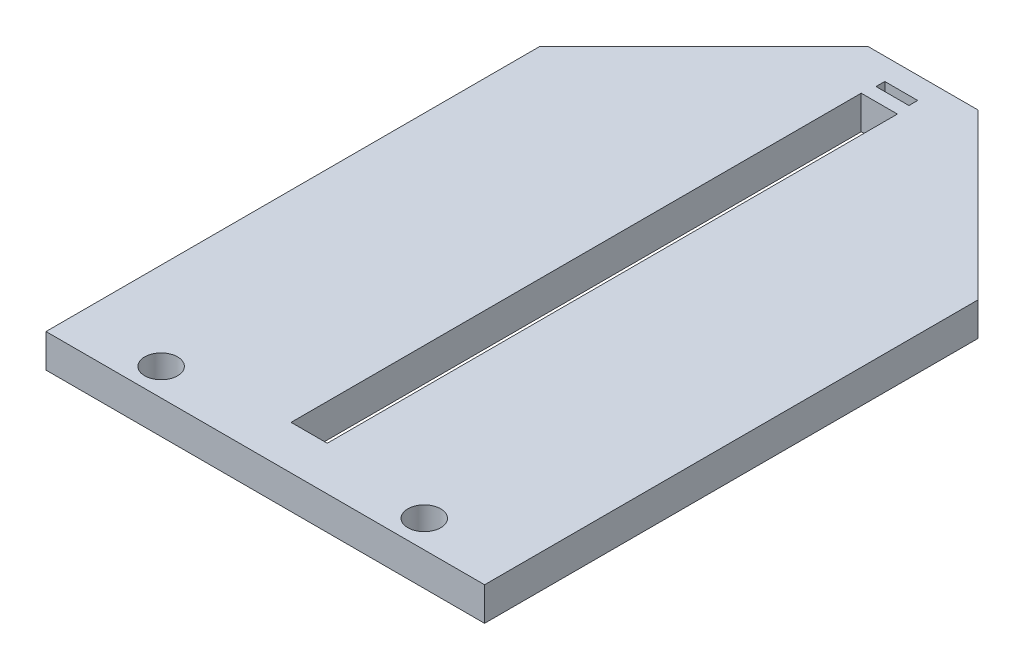
ISO-10303-21;
HEADER;
FILE_DESCRIPTION(('STEP AP214'),'2;1');
FILE_NAME('part.step','',(''),(''),'','','');
FILE_SCHEMA(('AUTOMOTIVE_DESIGN { 1 0 10303 214 1 1 1 1 }'));
ENDSEC;
DATA;
#1=APPLICATION_CONTEXT('core data for automotive mechanical design processes');
#2=APPLICATION_PROTOCOL_DEFINITION('international standard','automotive_design',2000,#1);
#3=PRODUCT_CONTEXT('',#1,'mechanical');
#4=PRODUCT('Part','Part','',(#3));
#5=PRODUCT_RELATED_PRODUCT_CATEGORY('part','',(#4));
#6=PRODUCT_DEFINITION_FORMATION('','',#4);
#7=PRODUCT_DEFINITION_CONTEXT('part definition',#1,'design');
#8=PRODUCT_DEFINITION('design','',#6,#7);
#9=PRODUCT_DEFINITION_SHAPE('','',#8);
#10=(LENGTH_UNIT() NAMED_UNIT(*) SI_UNIT(.MILLI.,.METRE.));
#11=(NAMED_UNIT(*) PLANE_ANGLE_UNIT() SI_UNIT($,.RADIAN.));
#12=(NAMED_UNIT(*) SI_UNIT($,.STERADIAN.) SOLID_ANGLE_UNIT());
#13=UNCERTAINTY_MEASURE_WITH_UNIT(LENGTH_MEASURE(1.E-05),#10,'distance_accuracy_value','');
#14=(GEOMETRIC_REPRESENTATION_CONTEXT(3) GLOBAL_UNCERTAINTY_ASSIGNED_CONTEXT((#13)) GLOBAL_UNIT_ASSIGNED_CONTEXT((#10,
#11,#12)) REPRESENTATION_CONTEXT('',''));
#15=CARTESIAN_POINT('',(0.,0.,0.));
#16=DIRECTION('',(0.,0.,1.));
#17=DIRECTION('',(1.,0.,0.));
#18=AXIS2_PLACEMENT_3D('',#15,#16,#17);
#19=CARTESIAN_POINT('',(0.,3.05,0.));
#20=DIRECTION('',(0.,0.,-1.));
#21=DIRECTION('',(-1.,0.,0.));
#22=AXIS2_PLACEMENT_3D('',#19,#20,#21);
#23=PLANE('',#22);
#24=DIRECTION('',(1.,0.,0.));
#25=VECTOR('',#24,1.);
#26=CARTESIAN_POINT('',(0.,0.,0.));
#27=LINE('',#26,#25);
#28=CARTESIAN_POINT('',(0.,0.,0.));
#29=VERTEX_POINT('',#28);
#30=CARTESIAN_POINT('',(40.,0.,0.));
#31=VERTEX_POINT('',#30);
#32=EDGE_CURVE('E174',#29,#31,#27,.T.);
#33=ORIENTED_EDGE('',*,*,#32,.T.);
#34=DIRECTION('',(0.,-1.,0.));
#35=VECTOR('',#34,1.);
#36=CARTESIAN_POINT('',(40.,3.05,0.));
#37=LINE('',#36,#35);
#38=CARTESIAN_POINT('',(40.,3.05,0.));
#39=VERTEX_POINT('',#38);
#40=EDGE_CURVE('E168',#39,#31,#37,.T.);
#41=ORIENTED_EDGE('',*,*,#40,.F.);
#42=DIRECTION('',(1.,0.,0.));
#43=VECTOR('',#42,1.);
#44=CARTESIAN_POINT('',(0.,3.05,0.));
#45=LINE('',#44,#43);
#46=CARTESIAN_POINT('',(0.,3.05,0.));
#47=VERTEX_POINT('',#46);
#48=EDGE_CURVE('E185',#47,#39,#45,.T.);
#49=ORIENTED_EDGE('',*,*,#48,.F.);
#50=DIRECTION('',(0.,-1.,0.));
#51=VECTOR('',#50,1.);
#52=CARTESIAN_POINT('',(0.,3.05,0.));
#53=LINE('',#52,#51);
#54=EDGE_CURVE('E165',#47,#29,#53,.T.);
#55=ORIENTED_EDGE('',*,*,#54,.T.);
#56=EDGE_LOOP('',(#33,#41,#49,#55));
#57=FACE_BOUND('',#56,.T.);
#58=ADVANCED_FACE('F44',(#57),#23,.F.);
#59=CARTESIAN_POINT('',(40.,3.05,0.));
#60=DIRECTION('',(-1.,0.,0.));
#61=DIRECTION('',(0.,0.,1.));
#62=AXIS2_PLACEMENT_3D('',#59,#60,#61);
#63=PLANE('',#62);
#64=DIRECTION('',(0.,0.,-1.));
#65=VECTOR('',#64,1.);
#66=CARTESIAN_POINT('',(40.,0.,0.));
#67=LINE('',#66,#65);
#68=CARTESIAN_POINT('',(40.,0.,-45.));
#69=VERTEX_POINT('',#68);
#70=EDGE_CURVE('E177',#31,#69,#67,.T.);
#71=ORIENTED_EDGE('',*,*,#70,.T.);
#72=DIRECTION('',(0.,1.,0.));
#73=VECTOR('',#72,1.);
#74=CARTESIAN_POINT('',(40.,-6.95,-45.));
#75=LINE('',#74,#73);
#76=CARTESIAN_POINT('',(40.,3.05,-45.));
#77=VERTEX_POINT('',#76);
#78=EDGE_CURVE('E60',#69,#77,#75,.T.);
#79=ORIENTED_EDGE('',*,*,#78,.T.);
#80=DIRECTION('',(0.,0.,-1.));
#81=VECTOR('',#80,1.);
#82=CARTESIAN_POINT('',(40.,3.05,0.));
#83=LINE('',#82,#81);
#84=EDGE_CURVE('E170',#39,#77,#83,.T.);
#85=ORIENTED_EDGE('',*,*,#84,.F.);
#86=ORIENTED_EDGE('',*,*,#40,.T.);
#87=EDGE_LOOP('',(#71,#79,#85,#86));
#88=FACE_BOUND('',#87,.T.);
#89=ADVANCED_FACE('F274',(#88),#63,.F.);
#90=CARTESIAN_POINT('',(0.,3.05,-60.));
#91=DIRECTION('',(0.,0.,-1.));
#92=DIRECTION('',(-1.,0.,0.));
#93=AXIS2_PLACEMENT_3D('',#90,#91,#92);
#94=PLANE('',#93);
#95=DIRECTION('',(0.,1.,0.));
#96=VECTOR('',#95,1.);
#97=CARTESIAN_POINT('',(15.,-6.95,-60.));
#98=LINE('',#97,#96);
#99=CARTESIAN_POINT('',(15.,0.,-60.));
#100=VERTEX_POINT('',#99);
#101=CARTESIAN_POINT('',(15.,3.05,-60.));
#102=VERTEX_POINT('',#101);
#103=EDGE_CURVE('E68',#100,#102,#98,.T.);
#104=ORIENTED_EDGE('',*,*,#103,.T.);
#105=DIRECTION('',(1.,0.,0.));
#106=VECTOR('',#105,1.);
#107=CARTESIAN_POINT('',(0.,3.05,-60.));
#108=LINE('',#107,#106);
#109=CARTESIAN_POINT('',(25.,3.05,-60.));
#110=VERTEX_POINT('',#109);
#111=EDGE_CURVE('E161',#102,#110,#108,.T.);
#112=ORIENTED_EDGE('',*,*,#111,.T.);
#113=DIRECTION('',(0.,1.,0.));
#114=VECTOR('',#113,1.);
#115=CARTESIAN_POINT('',(25.,-6.95,-60.));
#116=LINE('',#115,#114);
#117=CARTESIAN_POINT('',(25.,0.,-60.));
#118=VERTEX_POINT('',#117);
#119=EDGE_CURVE('E229',#118,#110,#116,.T.);
#120=ORIENTED_EDGE('',*,*,#119,.F.);
#121=DIRECTION('',(1.,0.,0.));
#122=VECTOR('',#121,1.);
#123=CARTESIAN_POINT('',(0.,0.,-60.));
#124=LINE('',#123,#122);
#125=EDGE_CURVE('E181',#100,#118,#124,.T.);
#126=ORIENTED_EDGE('',*,*,#125,.F.);
#127=EDGE_LOOP('',(#104,#112,#120,#126));
#128=FACE_BOUND('',#127,.T.);
#129=ADVANCED_FACE('F282',(#128),#94,.T.);
#130=CARTESIAN_POINT('',(0.,3.05,0.));
#131=DIRECTION('',(-1.,0.,0.));
#132=DIRECTION('',(0.,0.,1.));
#133=AXIS2_PLACEMENT_3D('',#130,#131,#132);
#134=PLANE('',#133);
#135=DIRECTION('',(0.,1.,0.));
#136=VECTOR('',#135,1.);
#137=CARTESIAN_POINT('',(0.,-6.95,-45.));
#138=LINE('',#137,#136);
#139=CARTESIAN_POINT('',(0.,0.,-45.));
#140=VERTEX_POINT('',#139);
#141=CARTESIAN_POINT('',(0.,3.05,-45.));
#142=VERTEX_POINT('',#141);
#143=EDGE_CURVE('E143',#140,#142,#138,.T.);
#144=ORIENTED_EDGE('',*,*,#143,.F.);
#145=DIRECTION('',(0.,0.,-1.));
#146=VECTOR('',#145,1.);
#147=CARTESIAN_POINT('',(0.,0.,0.));
#148=LINE('',#147,#146);
#149=EDGE_CURVE('E184',#29,#140,#148,.T.);
#150=ORIENTED_EDGE('',*,*,#149,.F.);
#151=ORIENTED_EDGE('',*,*,#54,.F.);
#152=DIRECTION('',(0.,0.,-1.));
#153=VECTOR('',#152,1.);
#154=CARTESIAN_POINT('',(0.,3.05,0.));
#155=LINE('',#154,#153);
#156=EDGE_CURVE('E158',#47,#142,#155,.T.);
#157=ORIENTED_EDGE('',*,*,#156,.T.);
#158=EDGE_LOOP('',(#144,#150,#151,#157));
#159=FACE_BOUND('',#158,.T.);
#160=ADVANCED_FACE('F164',(#159),#134,.T.);
#161=CARTESIAN_POINT('',(0.,3.05,0.));
#162=DIRECTION('',(0.,1.,0.));
#163=DIRECTION('',(0.,0.,1.));
#164=AXIS2_PLACEMENT_3D('',#161,#162,#163);
#165=PLANE('',#164);
#166=CARTESIAN_POINT('',(8.,3.05,-2.5));
#167=DIRECTION('',(0.,1.,0.));
#168=DIRECTION('',(0.,0.,1.));
#169=AXIS2_PLACEMENT_3D('',#166,#167,#168);
#170=CIRCLE('',#169,1.5);
#171=CARTESIAN_POINT('',(8.,3.05,-0.999999999999999));
#172=VERTEX_POINT('',#171);
#173=EDGE_CURVE('E215',#172,#172,#170,.T.);
#174=ORIENTED_EDGE('',*,*,#173,.F.);
#175=EDGE_LOOP('',(#174));
#176=FACE_BOUND('',#175,.T.);
#177=CARTESIAN_POINT('',(32.,3.05,-2.5));
#178=DIRECTION('',(0.,1.,0.));
#179=DIRECTION('',(0.,0.,1.));
#180=AXIS2_PLACEMENT_3D('',#177,#178,#179);
#181=CIRCLE('',#180,1.50000000000003);
#182=CARTESIAN_POINT('',(32.,3.05,-0.999999999999974));
#183=VERTEX_POINT('',#182);
#184=EDGE_CURVE('E220',#183,#183,#181,.T.);
#185=ORIENTED_EDGE('',*,*,#184,.F.);
#186=EDGE_LOOP('',(#185));
#187=FACE_BOUND('',#186,.T.);
#188=DIRECTION('',(0.707106781186547,0.,-0.707106781186548));
#189=VECTOR('',#188,1.);
#190=CARTESIAN_POINT('',(15.,3.05,-60.));
#191=LINE('',#190,#189);
#192=EDGE_CURVE('E146',#142,#102,#191,.T.);
#193=ORIENTED_EDGE('',*,*,#192,.F.);
#194=ORIENTED_EDGE('',*,*,#156,.F.);
#195=ORIENTED_EDGE('',*,*,#48,.T.);
#196=ORIENTED_EDGE('',*,*,#84,.T.);
#197=DIRECTION('',(0.707106781186547,0.,0.707106781186547));
#198=VECTOR('',#197,1.);
#199=CARTESIAN_POINT('',(25.,3.05,-60.));
#200=LINE('',#199,#198);
#201=EDGE_CURVE('E162',#110,#77,#200,.T.);
#202=ORIENTED_EDGE('',*,*,#201,.F.);
#203=ORIENTED_EDGE('',*,*,#111,.F.);
#204=EDGE_LOOP('',(#193,#194,#195,#196,#202,#203));
#205=FACE_BOUND('',#204,.T.);
#206=DIRECTION('',(1.,0.,0.));
#207=VECTOR('',#206,1.);
#208=CARTESIAN_POINT('',(0.,3.05,-4.));
#209=LINE('',#208,#207);
#210=CARTESIAN_POINT('',(18.35,3.05,-4.));
#211=VERTEX_POINT('',#210);
#212=CARTESIAN_POINT('',(21.65,3.05,-4.));
#213=VERTEX_POINT('',#212);
#214=EDGE_CURVE('E233',#211,#213,#209,.T.);
#215=ORIENTED_EDGE('',*,*,#214,.F.);
#216=DIRECTION('',(0.,0.,1.));
#217=VECTOR('',#216,1.);
#218=CARTESIAN_POINT('',(18.35,3.05,0.));
#219=LINE('',#218,#217);
#220=CARTESIAN_POINT('',(18.35,3.05,-56.));
#221=VERTEX_POINT('',#220);
#222=EDGE_CURVE('E242',#221,#211,#219,.T.);
#223=ORIENTED_EDGE('',*,*,#222,.F.);
#224=DIRECTION('',(-1.,0.,0.));
#225=VECTOR('',#224,1.);
#226=CARTESIAN_POINT('',(0.,3.05,-56.));
#227=LINE('',#226,#225);
#228=CARTESIAN_POINT('',(21.65,3.05,-56.));
#229=VERTEX_POINT('',#228);
#230=EDGE_CURVE('E239',#229,#221,#227,.T.);
#231=ORIENTED_EDGE('',*,*,#230,.F.);
#232=DIRECTION('',(0.,0.,-1.));
#233=VECTOR('',#232,1.);
#234=CARTESIAN_POINT('',(21.65,3.05,0.));
#235=LINE('',#234,#233);
#236=EDGE_CURVE('E235',#213,#229,#235,.T.);
#237=ORIENTED_EDGE('',*,*,#236,.F.);
#238=EDGE_LOOP('',(#215,#223,#231,#237));
#239=FACE_BOUND('',#238,.T.);
#240=DIRECTION('',(1.,0.,0.));
#241=VECTOR('',#240,1.);
#242=CARTESIAN_POINT('',(0.,3.05,-57.2));
#243=LINE('',#242,#241);
#244=CARTESIAN_POINT('',(18.5,3.05,-57.2));
#245=VERTEX_POINT('',#244);
#246=CARTESIAN_POINT('',(21.5,3.05,-57.2));
#247=VERTEX_POINT('',#246);
#248=EDGE_CURVE('E227',#245,#247,#243,.T.);
#249=ORIENTED_EDGE('',*,*,#248,.F.);
#250=DIRECTION('',(0.,0.,1.));
#251=VECTOR('',#250,1.);
#252=CARTESIAN_POINT('',(18.5000000000003,3.05,0.));
#253=LINE('',#252,#251);
#254=CARTESIAN_POINT('',(18.5,3.05,-58.));
#255=VERTEX_POINT('',#254);
#256=EDGE_CURVE('E260',#255,#245,#253,.T.);
#257=ORIENTED_EDGE('',*,*,#256,.F.);
#258=DIRECTION('',(-1.,0.,0.));
#259=VECTOR('',#258,1.);
#260=CARTESIAN_POINT('',(0.,3.05,-58.));
#261=LINE('',#260,#259);
#262=CARTESIAN_POINT('',(21.5,3.05,-58.));
#263=VERTEX_POINT('',#262);
#264=EDGE_CURVE('E257',#263,#255,#261,.T.);
#265=ORIENTED_EDGE('',*,*,#264,.F.);
#266=DIRECTION('',(0.,0.,-1.));
#267=VECTOR('',#266,1.);
#268=CARTESIAN_POINT('',(21.4999999999995,3.05,1.86482773667502E-13));
#269=LINE('',#268,#267);
#270=EDGE_CURVE('E254',#247,#263,#269,.T.);
#271=ORIENTED_EDGE('',*,*,#270,.F.);
#272=EDGE_LOOP('',(#249,#257,#265,#271));
#273=FACE_BOUND('',#272,.T.);
#274=ADVANCED_FACE('F155',(#176,#187,#205,#239,#273),#165,.T.);
#275=CARTESIAN_POINT('',(0.,0.,0.));
#276=DIRECTION('',(0.,1.,0.));
#277=DIRECTION('',(0.,0.,1.));
#278=AXIS2_PLACEMENT_3D('',#275,#276,#277);
#279=PLANE('',#278);
#280=CARTESIAN_POINT('',(8.,0.,-2.5));
#281=DIRECTION('',(0.,1.,0.));
#282=DIRECTION('',(0.,0.,1.));
#283=AXIS2_PLACEMENT_3D('',#280,#281,#282);
#284=CIRCLE('',#283,1.5);
#285=CARTESIAN_POINT('',(8.,0.,-0.999999999999999));
#286=VERTEX_POINT('',#285);
#287=EDGE_CURVE('E47',#286,#286,#284,.T.);
#288=ORIENTED_EDGE('',*,*,#287,.T.);
#289=EDGE_LOOP('',(#288));
#290=FACE_BOUND('',#289,.T.);
#291=CARTESIAN_POINT('',(32.,0.,-2.5));
#292=DIRECTION('',(0.,1.,0.));
#293=DIRECTION('',(0.,0.,1.));
#294=AXIS2_PLACEMENT_3D('',#291,#292,#293);
#295=CIRCLE('',#294,1.50000000000003);
#296=CARTESIAN_POINT('',(32.,0.,-0.999999999999974));
#297=VERTEX_POINT('',#296);
#298=EDGE_CURVE('E213',#297,#297,#295,.T.);
#299=ORIENTED_EDGE('',*,*,#298,.T.);
#300=EDGE_LOOP('',(#299));
#301=FACE_BOUND('',#300,.T.);
#302=DIRECTION('',(0.,0.,1.));
#303=VECTOR('',#302,1.);
#304=CARTESIAN_POINT('',(18.35,0.,0.));
#305=LINE('',#304,#303);
#306=CARTESIAN_POINT('',(18.35,0.,-56.));
#307=VERTEX_POINT('',#306);
#308=CARTESIAN_POINT('',(18.35,0.,-4.));
#309=VERTEX_POINT('',#308);
#310=EDGE_CURVE('E207',#307,#309,#305,.T.);
#311=ORIENTED_EDGE('',*,*,#310,.T.);
#312=DIRECTION('',(1.,0.,0.));
#313=VECTOR('',#312,1.);
#314=CARTESIAN_POINT('',(0.,0.,-4.));
#315=LINE('',#314,#313);
#316=CARTESIAN_POINT('',(21.65,0.,-4.));
#317=VERTEX_POINT('',#316);
#318=EDGE_CURVE('E210',#309,#317,#315,.T.);
#319=ORIENTED_EDGE('',*,*,#318,.T.);
#320=DIRECTION('',(0.,0.,-1.));
#321=VECTOR('',#320,1.);
#322=CARTESIAN_POINT('',(21.65,0.,0.));
#323=LINE('',#322,#321);
#324=CARTESIAN_POINT('',(21.65,0.,-56.));
#325=VERTEX_POINT('',#324);
#326=EDGE_CURVE('E201',#317,#325,#323,.T.);
#327=ORIENTED_EDGE('',*,*,#326,.T.);
#328=DIRECTION('',(-1.,0.,0.));
#329=VECTOR('',#328,1.);
#330=CARTESIAN_POINT('',(0.,0.,-56.));
#331=LINE('',#330,#329);
#332=EDGE_CURVE('E204',#325,#307,#331,.T.);
#333=ORIENTED_EDGE('',*,*,#332,.T.);
#334=EDGE_LOOP('',(#311,#319,#327,#333));
#335=FACE_BOUND('',#334,.T.);
#336=DIRECTION('',(0.,0.,1.));
#337=VECTOR('',#336,1.);
#338=CARTESIAN_POINT('',(18.5000000000003,0.,0.));
#339=LINE('',#338,#337);
#340=CARTESIAN_POINT('',(18.5,0.,-58.));
#341=VERTEX_POINT('',#340);
#342=CARTESIAN_POINT('',(18.5,0.,-57.2));
#343=VERTEX_POINT('',#342);
#344=EDGE_CURVE('E195',#341,#343,#339,.T.);
#345=ORIENTED_EDGE('',*,*,#344,.T.);
#346=DIRECTION('',(1.,0.,0.));
#347=VECTOR('',#346,1.);
#348=CARTESIAN_POINT('',(0.,0.,-57.2));
#349=LINE('',#348,#347);
#350=CARTESIAN_POINT('',(21.5,0.,-57.2));
#351=VERTEX_POINT('',#350);
#352=EDGE_CURVE('E198',#343,#351,#349,.T.);
#353=ORIENTED_EDGE('',*,*,#352,.T.);
#354=DIRECTION('',(0.,0.,-1.));
#355=VECTOR('',#354,1.);
#356=CARTESIAN_POINT('',(21.4999999999995,0.,1.86482773667502E-13));
#357=LINE('',#356,#355);
#358=CARTESIAN_POINT('',(21.5,0.,-58.));
#359=VERTEX_POINT('',#358);
#360=EDGE_CURVE('E189',#351,#359,#357,.T.);
#361=ORIENTED_EDGE('',*,*,#360,.T.);
#362=DIRECTION('',(-1.,0.,0.));
#363=VECTOR('',#362,1.);
#364=CARTESIAN_POINT('',(0.,0.,-58.));
#365=LINE('',#364,#363);
#366=EDGE_CURVE('E192',#359,#341,#365,.T.);
#367=ORIENTED_EDGE('',*,*,#366,.T.);
#368=EDGE_LOOP('',(#345,#353,#361,#367));
#369=FACE_BOUND('',#368,.T.);
#370=ORIENTED_EDGE('',*,*,#149,.T.);
#371=DIRECTION('',(0.707106781186547,0.,-0.707106781186548));
#372=VECTOR('',#371,1.);
#373=CARTESIAN_POINT('',(-22.5,0.,-22.5));
#374=LINE('',#373,#372);
#375=EDGE_CURVE('E11',#140,#100,#374,.T.);
#376=ORIENTED_EDGE('',*,*,#375,.T.);
#377=ORIENTED_EDGE('',*,*,#125,.T.);
#378=DIRECTION('',(0.707106781186548,0.,0.707106781186548));
#379=VECTOR('',#378,1.);
#380=CARTESIAN_POINT('',(42.5,0.,-42.5));
#381=LINE('',#380,#379);
#382=EDGE_CURVE('E52',#118,#69,#381,.T.);
#383=ORIENTED_EDGE('',*,*,#382,.T.);
#384=ORIENTED_EDGE('',*,*,#70,.F.);
#385=ORIENTED_EDGE('',*,*,#32,.F.);
#386=EDGE_LOOP('',(#370,#376,#377,#383,#384,#385));
#387=FACE_BOUND('',#386,.T.);
#388=ADVANCED_FACE('F277',(#290,#301,#335,#369,#387),#279,.F.);
#389=CARTESIAN_POINT('',(0.,-6.95,-57.2));
#390=DIRECTION('',(0.,0.,1.));
#391=DIRECTION('',(1.,0.,0.));
#392=AXIS2_PLACEMENT_3D('',#389,#390,#391);
#393=PLANE('',#392);
#394=DIRECTION('',(0.,1.,0.));
#395=VECTOR('',#394,1.);
#396=CARTESIAN_POINT('',(18.5,-6.95,-57.2));
#397=LINE('',#396,#395);
#398=EDGE_CURVE('E236',#343,#245,#397,.T.);
#399=ORIENTED_EDGE('',*,*,#398,.T.);
#400=ORIENTED_EDGE('',*,*,#248,.T.);
#401=DIRECTION('',(0.,1.,0.));
#402=VECTOR('',#401,1.);
#403=CARTESIAN_POINT('',(21.5,-6.95,-57.2));
#404=LINE('',#403,#402);
#405=EDGE_CURVE('E263',#351,#247,#404,.T.);
#406=ORIENTED_EDGE('',*,*,#405,.F.);
#407=ORIENTED_EDGE('',*,*,#352,.F.);
#408=EDGE_LOOP('',(#399,#400,#406,#407));
#409=FACE_BOUND('',#408,.T.);
#410=ADVANCED_FACE('F354',(#409),#393,.F.);
#411=CARTESIAN_POINT('',(18.5000000000003,-6.95,0.));
#412=DIRECTION('',(-1.,0.,0.));
#413=DIRECTION('',(0.,0.,1.));
#414=AXIS2_PLACEMENT_3D('',#411,#412,#413);
#415=PLANE('',#414);
#416=DIRECTION('',(0.,1.,0.));
#417=VECTOR('',#416,1.);
#418=CARTESIAN_POINT('',(18.5,-6.95,-58.));
#419=LINE('',#418,#417);
#420=EDGE_CURVE('E265',#341,#255,#419,.T.);
#421=ORIENTED_EDGE('',*,*,#420,.T.);
#422=ORIENTED_EDGE('',*,*,#256,.T.);
#423=ORIENTED_EDGE('',*,*,#398,.F.);
#424=ORIENTED_EDGE('',*,*,#344,.F.);
#425=EDGE_LOOP('',(#421,#422,#423,#424));
#426=FACE_BOUND('',#425,.T.);
#427=ADVANCED_FACE('F432',(#426),#415,.F.);
#428=CARTESIAN_POINT('',(0.,-6.95,-58.));
#429=DIRECTION('',(0.,0.,-1.));
#430=DIRECTION('',(-1.,0.,0.));
#431=AXIS2_PLACEMENT_3D('',#428,#429,#430);
#432=PLANE('',#431);
#433=DIRECTION('',(0.,1.,0.));
#434=VECTOR('',#433,1.);
#435=CARTESIAN_POINT('',(21.5,-6.95,-58.));
#436=LINE('',#435,#434);
#437=EDGE_CURVE('E267',#359,#263,#436,.T.);
#438=ORIENTED_EDGE('',*,*,#437,.T.);
#439=ORIENTED_EDGE('',*,*,#264,.T.);
#440=ORIENTED_EDGE('',*,*,#420,.F.);
#441=ORIENTED_EDGE('',*,*,#366,.F.);
#442=EDGE_LOOP('',(#438,#439,#440,#441));
#443=FACE_BOUND('',#442,.T.);
#444=ADVANCED_FACE('F422',(#443),#432,.F.);
#445=CARTESIAN_POINT('',(21.4999999999995,-6.95,1.86482773667502E-13));
#446=DIRECTION('',(1.,0.,0.));
#447=DIRECTION('',(0.,0.,-1.));
#448=AXIS2_PLACEMENT_3D('',#445,#446,#447);
#449=PLANE('',#448);
#450=ORIENTED_EDGE('',*,*,#405,.T.);
#451=ORIENTED_EDGE('',*,*,#270,.T.);
#452=ORIENTED_EDGE('',*,*,#437,.F.);
#453=ORIENTED_EDGE('',*,*,#360,.F.);
#454=EDGE_LOOP('',(#450,#451,#452,#453));
#455=FACE_BOUND('',#454,.T.);
#456=ADVANCED_FACE('F412',(#455),#449,.F.);
#457=CARTESIAN_POINT('',(0.,-6.95,-4.));
#458=DIRECTION('',(0.,0.,1.));
#459=DIRECTION('',(1.,0.,0.));
#460=AXIS2_PLACEMENT_3D('',#457,#458,#459);
#461=PLANE('',#460);
#462=DIRECTION('',(0.,1.,0.));
#463=VECTOR('',#462,1.);
#464=CARTESIAN_POINT('',(18.35,-6.95,-4.));
#465=LINE('',#464,#463);
#466=EDGE_CURVE('E178',#309,#211,#465,.T.);
#467=ORIENTED_EDGE('',*,*,#466,.T.);
#468=ORIENTED_EDGE('',*,*,#214,.T.);
#469=DIRECTION('',(0.,1.,0.));
#470=VECTOR('',#469,1.);
#471=CARTESIAN_POINT('',(21.65,-6.95,-4.));
#472=LINE('',#471,#470);
#473=EDGE_CURVE('E245',#317,#213,#472,.T.);
#474=ORIENTED_EDGE('',*,*,#473,.F.);
#475=ORIENTED_EDGE('',*,*,#318,.F.);
#476=EDGE_LOOP('',(#467,#468,#474,#475));
#477=FACE_BOUND('',#476,.T.);
#478=ADVANCED_FACE('F402',(#477),#461,.F.);
#479=CARTESIAN_POINT('',(18.35,-6.95,0.));
#480=DIRECTION('',(-1.,0.,0.));
#481=DIRECTION('',(0.,0.,1.));
#482=AXIS2_PLACEMENT_3D('',#479,#480,#481);
#483=PLANE('',#482);
#484=DIRECTION('',(0.,1.,0.));
#485=VECTOR('',#484,1.);
#486=CARTESIAN_POINT('',(18.35,-6.95,-56.));
#487=LINE('',#486,#485);
#488=EDGE_CURVE('E247',#307,#221,#487,.T.);
#489=ORIENTED_EDGE('',*,*,#488,.T.);
#490=ORIENTED_EDGE('',*,*,#222,.T.);
#491=ORIENTED_EDGE('',*,*,#466,.F.);
#492=ORIENTED_EDGE('',*,*,#310,.F.);
#493=EDGE_LOOP('',(#489,#490,#491,#492));
#494=FACE_BOUND('',#493,.T.);
#495=ADVANCED_FACE('F393',(#494),#483,.F.);
#496=CARTESIAN_POINT('',(0.,-6.95,-56.));
#497=DIRECTION('',(0.,0.,-1.));
#498=DIRECTION('',(-1.,0.,0.));
#499=AXIS2_PLACEMENT_3D('',#496,#497,#498);
#500=PLANE('',#499);
#501=DIRECTION('',(0.,1.,0.));
#502=VECTOR('',#501,1.);
#503=CARTESIAN_POINT('',(21.65,-6.95,-56.));
#504=LINE('',#503,#502);
#505=EDGE_CURVE('E249',#325,#229,#504,.T.);
#506=ORIENTED_EDGE('',*,*,#505,.T.);
#507=ORIENTED_EDGE('',*,*,#230,.T.);
#508=ORIENTED_EDGE('',*,*,#488,.F.);
#509=ORIENTED_EDGE('',*,*,#332,.F.);
#510=EDGE_LOOP('',(#506,#507,#508,#509));
#511=FACE_BOUND('',#510,.T.);
#512=ADVANCED_FACE('F384',(#511),#500,.F.);
#513=CARTESIAN_POINT('',(21.65,-6.95,0.));
#514=DIRECTION('',(1.,0.,0.));
#515=DIRECTION('',(0.,0.,-1.));
#516=AXIS2_PLACEMENT_3D('',#513,#514,#515);
#517=PLANE('',#516);
#518=ORIENTED_EDGE('',*,*,#473,.T.);
#519=ORIENTED_EDGE('',*,*,#236,.T.);
#520=ORIENTED_EDGE('',*,*,#505,.F.);
#521=ORIENTED_EDGE('',*,*,#326,.F.);
#522=EDGE_LOOP('',(#518,#519,#520,#521));
#523=FACE_BOUND('',#522,.T.);
#524=ADVANCED_FACE('F306',(#523),#517,.F.);
#525=CARTESIAN_POINT('',(25.,-6.95,-60.));
#526=DIRECTION('',(-0.707106781186548,0.,0.707106781186548));
#527=DIRECTION('',(0.707106781186548,0.,0.707106781186548));
#528=AXIS2_PLACEMENT_3D('',#525,#526,#527);
#529=PLANE('',#528);
#530=ORIENTED_EDGE('',*,*,#119,.T.);
#531=ORIENTED_EDGE('',*,*,#201,.T.);
#532=ORIENTED_EDGE('',*,*,#78,.F.);
#533=ORIENTED_EDGE('',*,*,#382,.F.);
#534=EDGE_LOOP('',(#530,#531,#532,#533));
#535=FACE_BOUND('',#534,.T.);
#536=ADVANCED_FACE('F280',(#535),#529,.F.);
#537=CARTESIAN_POINT('',(15.,-6.95,-60.));
#538=DIRECTION('',(0.707106781186548,0.,0.707106781186547));
#539=DIRECTION('',(0.707106781186547,0.,-0.707106781186548));
#540=AXIS2_PLACEMENT_3D('',#537,#538,#539);
#541=PLANE('',#540);
#542=ORIENTED_EDGE('',*,*,#143,.T.);
#543=ORIENTED_EDGE('',*,*,#192,.T.);
#544=ORIENTED_EDGE('',*,*,#103,.F.);
#545=ORIENTED_EDGE('',*,*,#375,.F.);
#546=EDGE_LOOP('',(#542,#543,#544,#545));
#547=FACE_BOUND('',#546,.T.);
#548=ADVANCED_FACE('F145',(#547),#541,.F.);
#549=CARTESIAN_POINT('',(32.,-6.95,-2.5));
#550=DIRECTION('',(0.,1.,0.));
#551=DIRECTION('',(0.,0.,1.));
#552=AXIS2_PLACEMENT_3D('',#549,#550,#551);
#553=CYLINDRICAL_SURFACE('',#552,1.50000000000003);
#554=ORIENTED_EDGE('',*,*,#184,.T.);
#555=EDGE_LOOP('',(#554));
#556=FACE_BOUND('',#555,.T.);
#557=ORIENTED_EDGE('',*,*,#298,.F.);
#558=EDGE_LOOP('',(#557));
#559=FACE_BOUND('',#558,.T.);
#560=ADVANCED_FACE('F338',(#556,#559),#553,.F.);
#561=CARTESIAN_POINT('',(8.,-6.95,-2.5));
#562=DIRECTION('',(0.,1.,0.));
#563=DIRECTION('',(0.,0.,1.));
#564=AXIS2_PLACEMENT_3D('',#561,#562,#563);
#565=CYLINDRICAL_SURFACE('',#564,1.5);
#566=ORIENTED_EDGE('',*,*,#173,.T.);
#567=EDGE_LOOP('',(#566));
#568=FACE_BOUND('',#567,.T.);
#569=ORIENTED_EDGE('',*,*,#287,.F.);
#570=EDGE_LOOP('',(#569));
#571=FACE_BOUND('',#570,.T.);
#572=ADVANCED_FACE('F362',(#568,#571),#565,.F.);
#573=CLOSED_SHELL('',(#58,#89,#129,#160,#274,#388,#410,#427,#444,#456,#478,#495,#512,#524,#536,
#548,#560,#572));
#574=MANIFOLD_SOLID_BREP('B2',#573);
#575=ADVANCED_BREP_SHAPE_REPRESENTATION('',(#18,#574),#14);
#576=SHAPE_DEFINITION_REPRESENTATION(#9,#575);
ENDSEC;
END-ISO-10303-21;
